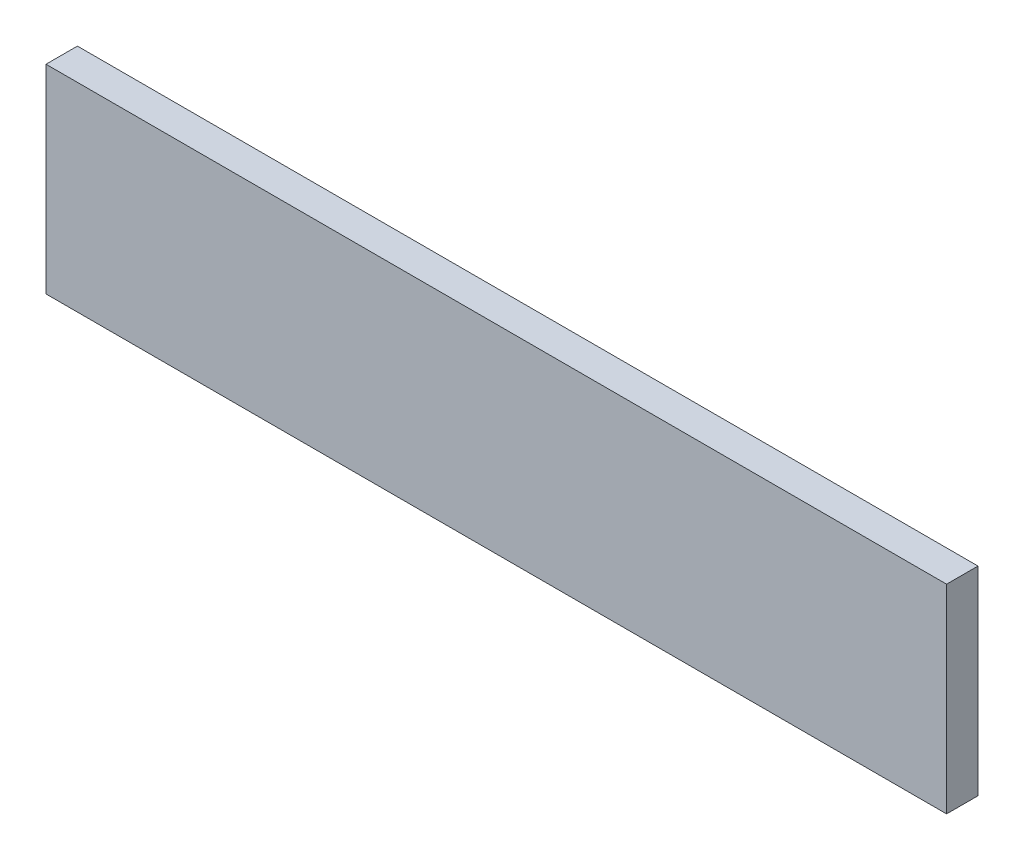
ISO-10303-21;
HEADER;
FILE_DESCRIPTION(('STEP AP214'),'2;1');
FILE_NAME('part.step','',(''),(''),'','','');
FILE_SCHEMA(('AUTOMOTIVE_DESIGN { 1 0 10303 214 1 1 1 1 }'));
ENDSEC;
DATA;
#1=APPLICATION_CONTEXT('core data for automotive mechanical design processes');
#2=APPLICATION_PROTOCOL_DEFINITION('international standard','automotive_design',2000,#1);
#3=PRODUCT_CONTEXT('',#1,'mechanical');
#4=PRODUCT('Part','Part','',(#3));
#5=PRODUCT_RELATED_PRODUCT_CATEGORY('part','',(#4));
#6=PRODUCT_DEFINITION_FORMATION('','',#4);
#7=PRODUCT_DEFINITION_CONTEXT('part definition',#1,'design');
#8=PRODUCT_DEFINITION('design','',#6,#7);
#9=PRODUCT_DEFINITION_SHAPE('','',#8);
#10=(LENGTH_UNIT() NAMED_UNIT(*) SI_UNIT(.MILLI.,.METRE.));
#11=(NAMED_UNIT(*) PLANE_ANGLE_UNIT() SI_UNIT($,.RADIAN.));
#12=(NAMED_UNIT(*) SI_UNIT($,.STERADIAN.) SOLID_ANGLE_UNIT());
#13=UNCERTAINTY_MEASURE_WITH_UNIT(LENGTH_MEASURE(1.E-05),#10,'distance_accuracy_value','');
#14=(GEOMETRIC_REPRESENTATION_CONTEXT(3) GLOBAL_UNCERTAINTY_ASSIGNED_CONTEXT((#13)) GLOBAL_UNIT_ASSIGNED_CONTEXT((#10,
#11,#12)) REPRESENTATION_CONTEXT('',''));
#15=CARTESIAN_POINT('',(0.,0.,0.));
#16=DIRECTION('',(0.,0.,1.));
#17=DIRECTION('',(1.,0.,0.));
#18=AXIS2_PLACEMENT_3D('',#15,#16,#17);
#19=CARTESIAN_POINT('',(215.,-47.5,15.));
#20=DIRECTION('',(-1.,0.,0.));
#21=DIRECTION('',(0.,0.,1.));
#22=AXIS2_PLACEMENT_3D('',#19,#20,#21);
#23=PLANE('',#22);
#24=DIRECTION('',(0.,1.,0.));
#25=VECTOR('',#24,1.);
#26=CARTESIAN_POINT('',(215.,-47.5,0.));
#27=LINE('',#26,#25);
#28=CARTESIAN_POINT('',(215.,-47.5,0.));
#29=VERTEX_POINT('',#28);
#30=CARTESIAN_POINT('',(215.,47.5,0.));
#31=VERTEX_POINT('',#30);
#32=EDGE_CURVE('E96',#29,#31,#27,.T.);
#33=ORIENTED_EDGE('',*,*,#32,.T.);
#34=DIRECTION('',(0.,0.,-1.));
#35=VECTOR('',#34,1.);
#36=CARTESIAN_POINT('',(215.,47.5,15.));
#37=LINE('',#36,#35);
#38=CARTESIAN_POINT('',(215.,47.5,15.));
#39=VERTEX_POINT('',#38);
#40=EDGE_CURVE('E11',#39,#31,#37,.T.);
#41=ORIENTED_EDGE('',*,*,#40,.F.);
#42=DIRECTION('',(0.,1.,0.));
#43=VECTOR('',#42,1.);
#44=CARTESIAN_POINT('',(215.,-47.5,15.));
#45=LINE('',#44,#43);
#46=CARTESIAN_POINT('',(215.,-47.5,15.));
#47=VERTEX_POINT('',#46);
#48=EDGE_CURVE('E84',#47,#39,#45,.T.);
#49=ORIENTED_EDGE('',*,*,#48,.F.);
#50=DIRECTION('',(0.,0.,-1.));
#51=VECTOR('',#50,1.);
#52=CARTESIAN_POINT('',(215.,-47.5,15.));
#53=LINE('',#52,#51);
#54=EDGE_CURVE('E92',#47,#29,#53,.T.);
#55=ORIENTED_EDGE('',*,*,#54,.T.);
#56=EDGE_LOOP('',(#33,#41,#49,#55));
#57=FACE_BOUND('',#56,.T.);
#58=ADVANCED_FACE('F33',(#57),#23,.F.);
#59=CARTESIAN_POINT('',(-215.,47.5,15.));
#60=DIRECTION('',(0.,-1.,0.));
#61=DIRECTION('',(0.,0.,-1.));
#62=AXIS2_PLACEMENT_3D('',#59,#60,#61);
#63=PLANE('',#62);
#64=DIRECTION('',(-1.,0.,0.));
#65=VECTOR('',#64,1.);
#66=CARTESIAN_POINT('',(-215.,47.5,0.));
#67=LINE('',#66,#65);
#68=CARTESIAN_POINT('',(-215.,47.5,0.));
#69=VERTEX_POINT('',#68);
#70=EDGE_CURVE('E88',#31,#69,#67,.T.);
#71=ORIENTED_EDGE('',*,*,#70,.T.);
#72=DIRECTION('',(0.,0.,-1.));
#73=VECTOR('',#72,1.);
#74=CARTESIAN_POINT('',(-215.,47.5,15.));
#75=LINE('',#74,#73);
#76=CARTESIAN_POINT('',(-215.,47.5,15.));
#77=VERTEX_POINT('',#76);
#78=EDGE_CURVE('E41',#77,#69,#75,.T.);
#79=ORIENTED_EDGE('',*,*,#78,.F.);
#80=DIRECTION('',(-1.,0.,0.));
#81=VECTOR('',#80,1.);
#82=CARTESIAN_POINT('',(-215.,47.5,15.));
#83=LINE('',#82,#81);
#84=EDGE_CURVE('E79',#39,#77,#83,.T.);
#85=ORIENTED_EDGE('',*,*,#84,.F.);
#86=ORIENTED_EDGE('',*,*,#40,.T.);
#87=EDGE_LOOP('',(#71,#79,#85,#86));
#88=FACE_BOUND('',#87,.T.);
#89=ADVANCED_FACE('F87',(#88),#63,.F.);
#90=CARTESIAN_POINT('',(-215.,-47.5,15.));
#91=DIRECTION('',(1.,0.,0.));
#92=DIRECTION('',(0.,0.,-1.));
#93=AXIS2_PLACEMENT_3D('',#90,#91,#92);
#94=PLANE('',#93);
#95=DIRECTION('',(0.,-1.,0.));
#96=VECTOR('',#95,1.);
#97=CARTESIAN_POINT('',(-215.,-47.5,0.));
#98=LINE('',#97,#96);
#99=CARTESIAN_POINT('',(-215.,-47.5,0.));
#100=VERTEX_POINT('',#99);
#101=EDGE_CURVE('E66',#69,#100,#98,.T.);
#102=ORIENTED_EDGE('',*,*,#101,.T.);
#103=DIRECTION('',(0.,0.,-1.));
#104=VECTOR('',#103,1.);
#105=CARTESIAN_POINT('',(-215.,-47.5,15.));
#106=LINE('',#105,#104);
#107=CARTESIAN_POINT('',(-215.,-47.5,15.));
#108=VERTEX_POINT('',#107);
#109=EDGE_CURVE('E89',#108,#100,#106,.T.);
#110=ORIENTED_EDGE('',*,*,#109,.F.);
#111=DIRECTION('',(0.,-1.,0.));
#112=VECTOR('',#111,1.);
#113=CARTESIAN_POINT('',(-215.,-47.5,15.));
#114=LINE('',#113,#112);
#115=EDGE_CURVE('E82',#77,#108,#114,.T.);
#116=ORIENTED_EDGE('',*,*,#115,.F.);
#117=ORIENTED_EDGE('',*,*,#78,.T.);
#118=EDGE_LOOP('',(#102,#110,#116,#117));
#119=FACE_BOUND('',#118,.T.);
#120=ADVANCED_FACE('F90',(#119),#94,.F.);
#121=CARTESIAN_POINT('',(-215.,-47.5,15.));
#122=DIRECTION('',(0.,1.,0.));
#123=DIRECTION('',(0.,0.,1.));
#124=AXIS2_PLACEMENT_3D('',#121,#122,#123);
#125=PLANE('',#124);
#126=DIRECTION('',(1.,0.,0.));
#127=VECTOR('',#126,1.);
#128=CARTESIAN_POINT('',(-215.,-47.5,0.));
#129=LINE('',#128,#127);
#130=EDGE_CURVE('E72',#100,#29,#129,.T.);
#131=ORIENTED_EDGE('',*,*,#130,.T.);
#132=ORIENTED_EDGE('',*,*,#54,.F.);
#133=DIRECTION('',(1.,0.,0.));
#134=VECTOR('',#133,1.);
#135=CARTESIAN_POINT('',(-215.,-47.5,15.));
#136=LINE('',#135,#134);
#137=EDGE_CURVE('E49',#108,#47,#136,.T.);
#138=ORIENTED_EDGE('',*,*,#137,.F.);
#139=ORIENTED_EDGE('',*,*,#109,.T.);
#140=EDGE_LOOP('',(#131,#132,#138,#139));
#141=FACE_BOUND('',#140,.T.);
#142=ADVANCED_FACE('F103',(#141),#125,.F.);
#143=CARTESIAN_POINT('',(0.,0.,15.));
#144=DIRECTION('',(0.,0.,-1.));
#145=DIRECTION('',(-1.,0.,0.));
#146=AXIS2_PLACEMENT_3D('',#143,#144,#145);
#147=PLANE('',#146);
#148=ORIENTED_EDGE('',*,*,#48,.T.);
#149=ORIENTED_EDGE('',*,*,#84,.T.);
#150=ORIENTED_EDGE('',*,*,#115,.T.);
#151=ORIENTED_EDGE('',*,*,#137,.T.);
#152=EDGE_LOOP('',(#148,#149,#150,#151));
#153=FACE_BOUND('',#152,.T.);
#154=ADVANCED_FACE('F80',(#153),#147,.F.);
#155=CARTESIAN_POINT('',(0.,0.,0.));
#156=DIRECTION('',(0.,0.,-1.));
#157=DIRECTION('',(-1.,0.,0.));
#158=AXIS2_PLACEMENT_3D('',#155,#156,#157);
#159=PLANE('',#158);
#160=ORIENTED_EDGE('',*,*,#32,.F.);
#161=ORIENTED_EDGE('',*,*,#130,.F.);
#162=ORIENTED_EDGE('',*,*,#101,.F.);
#163=ORIENTED_EDGE('',*,*,#70,.F.);
#164=EDGE_LOOP('',(#160,#161,#162,#163));
#165=FACE_BOUND('',#164,.T.);
#166=ADVANCED_FACE('F106',(#165),#159,.T.);
#167=CLOSED_SHELL('',(#58,#89,#120,#142,#154,#166));
#168=MANIFOLD_SOLID_BREP('B2',#167);
#169=ADVANCED_BREP_SHAPE_REPRESENTATION('',(#18,#168),#14);
#170=SHAPE_DEFINITION_REPRESENTATION(#9,#169);
ENDSEC;
END-ISO-10303-21;
